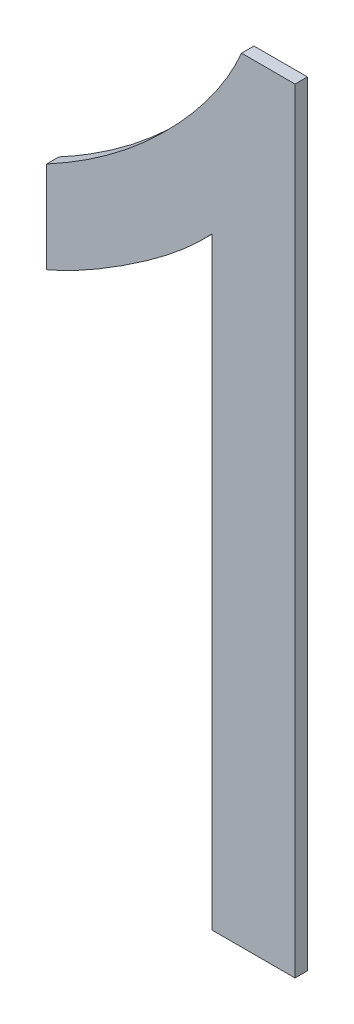
ISO-10303-21;
HEADER;
FILE_DESCRIPTION(('STEP AP214'),'2;1');
FILE_NAME('part.step','',(''),(''),'','','');
FILE_SCHEMA(('AUTOMOTIVE_DESIGN { 1 0 10303 214 1 1 1 1 }'));
ENDSEC;
DATA;
#1=APPLICATION_CONTEXT('core data for automotive mechanical design processes');
#2=APPLICATION_PROTOCOL_DEFINITION('international standard','automotive_design',2000,#1);
#3=PRODUCT_CONTEXT('',#1,'mechanical');
#4=PRODUCT('Part','Part','',(#3));
#5=PRODUCT_RELATED_PRODUCT_CATEGORY('part','',(#4));
#6=PRODUCT_DEFINITION_FORMATION('','',#4);
#7=PRODUCT_DEFINITION_CONTEXT('part definition',#1,'design');
#8=PRODUCT_DEFINITION('design','',#6,#7);
#9=PRODUCT_DEFINITION_SHAPE('','',#8);
#10=(LENGTH_UNIT() NAMED_UNIT(*) SI_UNIT(.MILLI.,.METRE.));
#11=(NAMED_UNIT(*) PLANE_ANGLE_UNIT() SI_UNIT($,.RADIAN.));
#12=(NAMED_UNIT(*) SI_UNIT($,.STERADIAN.) SOLID_ANGLE_UNIT());
#13=UNCERTAINTY_MEASURE_WITH_UNIT(LENGTH_MEASURE(1.E-05),#10,'distance_accuracy_value','');
#14=(GEOMETRIC_REPRESENTATION_CONTEXT(3) GLOBAL_UNCERTAINTY_ASSIGNED_CONTEXT((#13)) GLOBAL_UNIT_ASSIGNED_CONTEXT((#10,
#11,#12)) REPRESENTATION_CONTEXT('',''));
#15=CARTESIAN_POINT('',(0.,0.,0.));
#16=DIRECTION('',(0.,0.,1.));
#17=DIRECTION('',(1.,0.,0.));
#18=AXIS2_PLACEMENT_3D('',#15,#16,#17);
#19=CARTESIAN_POINT('',(2.420829277279,2.045230861556,1.11));
#20=DIRECTION('',(0.,0.,1.));
#21=DIRECTION('',(1.,0.,0.));
#22=AXIS2_PLACEMENT_3D('',#19,#20,#21);
#23=PLANE('',#22);
#24=DIRECTION('',(0.,1.,0.));
#25=VECTOR('',#24,1.);
#26=CARTESIAN_POINT('',(2.350671895533,2.005858178158,1.11));
#27=LINE('',#26,#25);
#28=CARTESIAN_POINT('',(2.350671895533,2.005858178158,1.11));
#29=VERTEX_POINT('',#28);
#30=CARTESIAN_POINT('',(2.350671895533,2.079661555173,1.11));
#31=VERTEX_POINT('',#30);
#32=EDGE_CURVE('E79',#29,#31,#27,.T.);
#33=ORIENTED_EDGE('',*,*,#32,.F.);
#34=CARTESIAN_POINT('',(2.484250601938,2.097794281422,1.11));
#35=CARTESIAN_POINT('',(2.48198701650468,2.09534058091258,1.11));
#36=CARTESIAN_POINT('',(2.47967240476367,2.09293513346055,1.11));
#37=CARTESIAN_POINT('',(2.47495516755422,2.08821521229537,1.11));
#38=CARTESIAN_POINT('',(2.4725526015537,2.08590067923014,1.11));
#39=CARTESIAN_POINT('',(2.46030040619767,2.07448990393132,1.11));
#40=CARTESIAN_POINT('',(2.44986724530582,2.06601649511369,1.11));
#41=CARTESIAN_POINT('',(2.42826373206573,2.05004923297731,1.11));
#42=CARTESIAN_POINT('',(2.41709135576111,2.04255825190439,1.11));
#43=CARTESIAN_POINT('',(2.39685681225412,2.0298426248223,1.11));
#44=CARTESIAN_POINT('',(2.38787975919878,2.02448514238348,1.11));
#45=CARTESIAN_POINT('',(2.36957839473494,2.01453142934613,1.11));
#46=CARTESIAN_POINT('',(2.36025611751061,2.00993140802081,1.11));
#47=CARTESIAN_POINT('',(2.350671895533,2.005858178158,1.11));
#48=B_SPLINE_CURVE_WITH_KNOTS('',3,(#34,#35,#36,#37,#38,#39,#40,#41,#42,#43,#44,#45,#46,#47),
.UNSPECIFIED.,.F.,.F.,(4,2,2,2,2,2,4),(0.,0.0100128481750778,0.0200190471259914,
0.0602358016008365,0.100567631074576,0.131904063335618,0.163078563736882),.UNSPECIFIED.);
#49=CARTESIAN_POINT('',(2.484250601938,2.097794281422,1.11));
#50=VERTEX_POINT('',#49);
#51=EDGE_CURVE('E176',#50,#29,#48,.T.);
#52=ORIENTED_EDGE('',*,*,#51,.F.);
#53=DIRECTION('',(0.,1.,0.));
#54=VECTOR('',#53,1.);
#55=CARTESIAN_POINT('',(2.484250601938,1.611391852731,1.11));
#56=LINE('',#55,#54);
#57=CARTESIAN_POINT('',(2.484250601938,1.611391852731,1.11));
#58=VERTEX_POINT('',#57);
#59=EDGE_CURVE('E130',#58,#50,#56,.T.);
#60=ORIENTED_EDGE('',*,*,#59,.F.);
#61=DIRECTION('',(1.,0.,0.));
#62=VECTOR('',#61,1.);
#63=CARTESIAN_POINT('',(2.55103995514,1.611391852731,1.11));
#64=LINE('',#63,#62);
#65=CARTESIAN_POINT('',(2.55103995514,1.611391852731,1.11));
#66=VERTEX_POINT('',#65);
#67=EDGE_CURVE('E125',#66,#58,#64,.F.);
#68=ORIENTED_EDGE('',*,*,#67,.F.);
#69=DIRECTION('',(0.,1.,0.));
#70=VECTOR('',#69,1.);
#71=CARTESIAN_POINT('',(2.55103995514,2.235698436319,1.11));
#72=LINE('',#71,#70);
#73=CARTESIAN_POINT('',(2.55103995514,2.235698436319,1.11));
#74=VERTEX_POINT('',#73);
#75=EDGE_CURVE('E96',#74,#66,#72,.F.);
#76=ORIENTED_EDGE('',*,*,#75,.F.);
#77=DIRECTION('',(1.,0.,0.));
#78=VECTOR('',#77,1.);
#79=CARTESIAN_POINT('',(2.50790516453,2.235698436319,1.11));
#80=LINE('',#79,#78);
#81=CARTESIAN_POINT('',(2.50790516453,2.235698436319,1.11));
#82=VERTEX_POINT('',#81);
#83=EDGE_CURVE('E94',#82,#74,#80,.T.);
#84=ORIENTED_EDGE('',*,*,#83,.F.);
#85=CARTESIAN_POINT('',(2.350671895533,2.079661555173,1.11));
#86=CARTESIAN_POINT('',(2.35654530439645,2.0828170617889,1.11));
#87=CARTESIAN_POINT('',(2.36234983727154,2.08610498024626,1.11));
#88=CARTESIAN_POINT('',(2.37959335986652,2.09640578820771,1.11));
#89=CARTESIAN_POINT('',(2.39079361968248,2.10382290423349,1.11));
#90=CARTESIAN_POINT('',(2.41240642351572,2.11973707684655,1.11));
#91=CARTESIAN_POINT('',(2.42281887448461,2.12823426068438,1.11));
#92=CARTESIAN_POINT('',(2.43770020110795,2.14174411779067,1.11));
#93=CARTESIAN_POINT('',(2.44252878913659,2.1463647099135,1.11));
#94=CARTESIAN_POINT('',(2.45194473883119,2.15583532033303,1.11));
#95=CARTESIAN_POINT('',(2.4565322924703,2.16068515001891,1.11));
#96=CARTESIAN_POINT('',(2.47039633924423,2.17610618301786,1.11));
#97=CARTESIAN_POINT('',(2.47925174991864,2.18707696799885,1.11));
#98=CARTESIAN_POINT('',(2.49119920418664,2.20450546832535,1.11));
#99=CARTESIAN_POINT('',(2.49496833453174,2.21049642169433,1.11));
#100=CARTESIAN_POINT('',(2.50191835633671,2.22283116989214,1.11));
#101=CARTESIAN_POINT('',(2.50509748730921,2.22917594950371,1.11));
#102=CARTESIAN_POINT('',(2.50790516453,2.235698436319,1.11));
#103=B_SPLINE_CURVE_WITH_KNOTS('',3,(#85,#86,#87,#88,#89,#90,#91,#92,#93,#94,#95,#96,#97,#98,
#99,#100,#101,#102),.UNSPECIFIED.,.F.,.F.,(4,2,2,2,2,2,2,2,4),(0.,0.0200050536586325,
0.0602425272926652,0.10048474599497,0.120525521335046,0.140550085298754,0.182704889379794,
0.203909580517864,0.225176560859281),.UNSPECIFIED.);
#104=EDGE_CURVE('E24',#31,#82,#103,.T.);
#105=ORIENTED_EDGE('',*,*,#104,.F.);
#106=EDGE_LOOP('',(#33,#52,#60,#68,#76,#84,#105));
#107=FACE_BOUND('',#106,.T.);
#108=ADVANCED_FACE('F17',(#107),#23,.T.);
#109=CARTESIAN_POINT('',(2.55103995514,2.235698436319,1.11));
#110=DIRECTION('',(1.,0.,0.));
#111=DIRECTION('',(0.,0.,-1.));
#112=AXIS2_PLACEMENT_3D('',#109,#110,#111);
#113=PLANE('',#112);
#114=DIRECTION('',(0.,1.,0.));
#115=VECTOR('',#114,1.);
#116=CARTESIAN_POINT('',(2.55103995514,2.045230861556,1.1));
#117=LINE('',#116,#115);
#118=CARTESIAN_POINT('',(2.55103995514,1.611391852731,1.1));
#119=VERTEX_POINT('',#118);
#120=CARTESIAN_POINT('',(2.55103995514,2.235698436319,1.1));
#121=VERTEX_POINT('',#120);
#122=EDGE_CURVE('E112',#119,#121,#117,.T.);
#123=ORIENTED_EDGE('',*,*,#122,.T.);
#124=DIRECTION('',(0.,0.,1.));
#125=VECTOR('',#124,1.);
#126=CARTESIAN_POINT('',(2.55103995514,2.235698436319,1.11));
#127=LINE('',#126,#125);
#128=EDGE_CURVE('E92',#74,#121,#127,.F.);
#129=ORIENTED_EDGE('',*,*,#128,.F.);
#130=ORIENTED_EDGE('',*,*,#75,.T.);
#131=DIRECTION('',(0.,0.,-1.));
#132=VECTOR('',#131,1.);
#133=CARTESIAN_POINT('',(2.55103995514,1.611391852731,1.11));
#134=LINE('',#133,#132);
#135=EDGE_CURVE('E115',#119,#66,#134,.F.);
#136=ORIENTED_EDGE('',*,*,#135,.F.);
#137=EDGE_LOOP('',(#123,#129,#130,#136));
#138=FACE_BOUND('',#137,.T.);
#139=ADVANCED_FACE('F167',(#138),#113,.T.);
#140=CARTESIAN_POINT('',(2.50790516453,2.235698436319,1.11));
#141=DIRECTION('',(0.,1.,0.));
#142=DIRECTION('',(0.,0.,1.));
#143=AXIS2_PLACEMENT_3D('',#140,#141,#142);
#144=PLANE('',#143);
#145=DIRECTION('',(1.,0.,0.));
#146=VECTOR('',#145,1.);
#147=CARTESIAN_POINT('',(2.420829277279,2.235698436319,1.1));
#148=LINE('',#147,#146);
#149=CARTESIAN_POINT('',(2.50790516453,2.235698436319,1.1));
#150=VERTEX_POINT('',#149);
#151=EDGE_CURVE('E103',#121,#150,#148,.F.);
#152=ORIENTED_EDGE('',*,*,#151,.T.);
#153=DIRECTION('',(0.,0.,-1.));
#154=VECTOR('',#153,1.);
#155=CARTESIAN_POINT('',(2.50790516453,2.235698436319,1.105));
#156=LINE('',#155,#154);
#157=EDGE_CURVE('E88',#82,#150,#156,.T.);
#158=ORIENTED_EDGE('',*,*,#157,.F.);
#159=ORIENTED_EDGE('',*,*,#83,.T.);
#160=ORIENTED_EDGE('',*,*,#128,.T.);
#161=EDGE_LOOP('',(#152,#158,#159,#160));
#162=FACE_BOUND('',#161,.T.);
#163=ADVANCED_FACE('F101',(#162),#144,.T.);
#164=CARTESIAN_POINT('',(2.350671895533,2.079661555173,1.11));
#165=CARTESIAN_POINT('',(2.350671895533,2.079661555173,1.1));
#166=CARTESIAN_POINT('',(2.387962617737,2.099702989449,1.11));
#167=CARTESIAN_POINT('',(2.387962617737,2.099702989449,1.1));
#168=CARTESIAN_POINT('',(2.420661571909,2.124039016783,1.11));
#169=CARTESIAN_POINT('',(2.420661571909,2.124039016783,1.1));
#170=CARTESIAN_POINT('',(2.476609230776,2.180993923525,1.11));
#171=CARTESIAN_POINT('',(2.476609230776,2.180993923525,1.1));
#172=CARTESIAN_POINT('',(2.496356172206,2.208817464949,1.11));
#173=CARTESIAN_POINT('',(2.496356172206,2.208817464949,1.1));
#174=CARTESIAN_POINT('',(2.50790516453,2.235698436319,1.11));
#175=CARTESIAN_POINT('',(2.50790516453,2.235698436319,1.1));
#176=B_SPLINE_SURFACE_WITH_KNOTS('',3,1,((#164,#165),(#166,#167),(#168,#169),(#170,#171),(#172,
#173),(#174,#175)),.UNSPECIFIED.,.F.,.F.,.F.,(4,2,4),(2,2),(0.,0.499896550102,1.),(0.,1.),.UNSPECIFIED.);
#177=CARTESIAN_POINT('',(2.50790516453,2.235698436319,1.1));
#178=CARTESIAN_POINT('',(2.50525863093719,2.22955759100521,1.1));
#179=CARTESIAN_POINT('',(2.50228694975985,2.22357328205006,1.1));
#180=CARTESIAN_POINT('',(2.4924955346722,2.20595058455844,1.1));
#181=CARTESIAN_POINT('',(2.4848420473745,2.19476969874483,1.1));
#182=CARTESIAN_POINT('',(2.46819045533764,2.17344737638529,1.1));
#183=CARTESIAN_POINT('',(2.45918724982893,2.16331014023607,1.1));
#184=CARTESIAN_POINT('',(2.44504859121431,2.14884539242523,1.1));
#185=CARTESIAN_POINT('',(2.44026136661624,2.14417379884545,1.1));
#186=CARTESIAN_POINT('',(2.43045639822626,2.13510449024433,1.1));
#187=CARTESIAN_POINT('',(2.42543927722939,2.13070610344323,1.1));
#188=CARTESIAN_POINT('',(2.40958620707663,2.11750726481689,1.1));
#189=CARTESIAN_POINT('',(2.39838095124761,2.10914682026167,1.1));
#190=CARTESIAN_POINT('',(2.37511345794947,2.09353939195043,1.1));
#191=CARTESIAN_POINT('',(2.36304616279148,2.08629993153091,1.1));
#192=CARTESIAN_POINT('',(2.350671895533,2.079661555173,1.1));
#193=B_SPLINE_CURVE_WITH_KNOTS('',3,(#177,#178,#179,#180,#181,#182,#183,#184,#185,#186,#187,
#188,#189,#190,#191,#192),.UNSPECIFIED.,.F.,.F.,(4,2,2,2,2,2,2,4),(0.,0.0200276017516876,
0.0604790442422037,0.101087402843664,0.121146642614684,0.141154429093648,0.18301895991956,
0.225153300971886),.UNSPECIFIED.);
#194=CARTESIAN_POINT('',(2.350671895533,2.079661555173,1.1));
#195=VERTEX_POINT('',#194);
#196=EDGE_CURVE('E145',#150,#195,#193,.T.);
#197=DIRECTION('',(0.,0.,1.));
#198=VECTOR('',#197,1.);
#199=CARTESIAN_POINT('',(2.350671895533,2.079661555173,1.11));
#200=LINE('',#199,#198);
#201=EDGE_CURVE('E90',#31,#195,#200,.F.);
#202=ORIENTED_EDGE('',*,*,#196,.T.);
#203=ORIENTED_EDGE('',*,*,#201,.F.);
#204=ORIENTED_EDGE('',*,*,#104,.T.);
#205=ORIENTED_EDGE('',*,*,#157,.T.);
#206=EDGE_LOOP('',(#202,#203,#204,#205));
#207=FACE_BOUND('',#206,.T.);
#208=ADVANCED_FACE('F86',(#207),#176,.T.);
#209=CARTESIAN_POINT('',(2.350671895533,2.005858178158,1.11));
#210=DIRECTION('',(-1.,0.,0.));
#211=DIRECTION('',(0.,0.,1.));
#212=AXIS2_PLACEMENT_3D('',#209,#210,#211);
#213=PLANE('',#212);
#214=DIRECTION('',(0.,1.,0.));
#215=VECTOR('',#214,1.);
#216=CARTESIAN_POINT('',(2.350671895533,2.045230861556,1.1));
#217=LINE('',#216,#215);
#218=CARTESIAN_POINT('',(2.350671895533,2.005858178158,1.1));
#219=VERTEX_POINT('',#218);
#220=EDGE_CURVE('E144',#195,#219,#217,.F.);
#221=ORIENTED_EDGE('',*,*,#220,.T.);
#222=DIRECTION('',(0.,0.,-1.));
#223=VECTOR('',#222,1.);
#224=CARTESIAN_POINT('',(2.350671895533,2.005858178158,1.105));
#225=LINE('',#224,#223);
#226=EDGE_CURVE('E132',#29,#219,#225,.T.);
#227=ORIENTED_EDGE('',*,*,#226,.F.);
#228=ORIENTED_EDGE('',*,*,#32,.T.);
#229=ORIENTED_EDGE('',*,*,#201,.T.);
#230=EDGE_LOOP('',(#221,#227,#228,#229));
#231=FACE_BOUND('',#230,.T.);
#232=ADVANCED_FACE('F162',(#231),#213,.T.);
#233=CARTESIAN_POINT('',(2.484250601938,2.097794281422,1.11));
#234=CARTESIAN_POINT('',(2.484250601938,2.097794281422,1.1));
#235=CARTESIAN_POINT('',(2.46810984158,2.080297791182,1.11));
#236=CARTESIAN_POINT('',(2.46810984158,2.080297791182,1.1));
#237=CARTESIAN_POINT('',(2.447099024219,2.062801300941,1.11));
#238=CARTESIAN_POINT('',(2.447099024219,2.062801300941,1.1));
#239=CARTESIAN_POINT('',(2.394706963567,2.027759003676,1.11));
#240=CARTESIAN_POINT('',(2.394706963567,2.027759003676,1.1));
#241=CARTESIAN_POINT('',(2.371404423923,2.014606423278,1.11));
#242=CARTESIAN_POINT('',(2.371404423923,2.014606423278,1.1));
#243=CARTESIAN_POINT('',(2.350671895533,2.005858178158,1.11));
#244=CARTESIAN_POINT('',(2.350671895533,2.005858178158,1.1));
#245=B_SPLINE_SURFACE_WITH_KNOTS('',3,1,((#233,#234),(#235,#236),(#237,#238),(#239,#240),(#241,
#242),(#243,#244)),.UNSPECIFIED.,.F.,.F.,.F.,(4,2,4),(2,2),(0.,0.49929632491,1.),(0.,1.),.UNSPECIFIED.);
#246=CARTESIAN_POINT('',(2.350671895533,2.005858178158,1.1));
#247=CARTESIAN_POINT('',(2.35374545334965,2.00715536495649,1.1));
#248=CARTESIAN_POINT('',(2.35679240638466,2.00851347238898,1.1));
#249=CARTESIAN_POINT('',(2.36283905883462,2.01133392696376,1.1));
#250=CARTESIAN_POINT('',(2.36583874181925,2.01279630941542,1.1));
#251=CARTESIAN_POINT('',(2.38076514106665,2.02034096789166,1.1));
#252=CARTESIAN_POINT('',(2.39236436211796,2.02707042783829,1.1));
#253=CARTESIAN_POINT('',(2.40941076935322,2.03770944515556,1.1));
#254=CARTESIAN_POINT('',(2.41503704031361,2.04134865100027,1.1));
#255=CARTESIAN_POINT('',(2.42616705512722,2.04880934596244,1.1));
#256=CARTESIAN_POINT('',(2.43167082568481,2.05263079476969,1.1));
#257=CARTESIAN_POINT('',(2.44553872737156,2.06274148667721,1.1));
#258=CARTESIAN_POINT('',(2.45377472155008,2.06921211691921,1.1));
#259=CARTESIAN_POINT('',(2.46957184314791,2.08290368617275,1.1));
#260=CARTESIAN_POINT('',(2.47713388337539,2.09012358076089,1.1));
#261=CARTESIAN_POINT('',(2.484250601938,2.097794281422,1.1));
#262=B_SPLINE_CURVE_WITH_KNOTS('',3,(#246,#247,#248,#249,#250,#251,#252,#253,#254,#255,#256,
#257,#258,#259,#260,#261),.UNSPECIFIED.,.F.,.F.,(4,2,2,2,2,2,2,4),(0.,0.0100063413576362,
0.0200160872788,0.0601775562632767,0.0802794939786955,0.100377005797557,0.131753143480201,
0.163086117923732),.UNSPECIFIED.);
#263=CARTESIAN_POINT('',(2.484250601938,2.097794281422,1.1));
#264=VERTEX_POINT('',#263);
#265=EDGE_CURVE('E137',#219,#264,#262,.T.);
#266=DIRECTION('',(0.,0.,1.));
#267=VECTOR('',#266,1.);
#268=CARTESIAN_POINT('',(2.484250601938,2.097794281422,1.11));
#269=LINE('',#268,#267);
#270=EDGE_CURVE('E127',#50,#264,#269,.F.);
#271=ORIENTED_EDGE('',*,*,#265,.T.);
#272=ORIENTED_EDGE('',*,*,#270,.F.);
#273=ORIENTED_EDGE('',*,*,#51,.T.);
#274=ORIENTED_EDGE('',*,*,#226,.T.);
#275=EDGE_LOOP('',(#271,#272,#273,#274));
#276=FACE_BOUND('',#275,.T.);
#277=ADVANCED_FACE('F19',(#276),#245,.T.);
#278=CARTESIAN_POINT('',(2.484250601938,1.611391852731,1.11));
#279=DIRECTION('',(-1.,0.,0.));
#280=DIRECTION('',(0.,0.,1.));
#281=AXIS2_PLACEMENT_3D('',#278,#279,#280);
#282=PLANE('',#281);
#283=DIRECTION('',(0.,1.,0.));
#284=VECTOR('',#283,1.);
#285=CARTESIAN_POINT('',(2.484250601938,2.045230861556,1.1));
#286=LINE('',#285,#284);
#287=CARTESIAN_POINT('',(2.484250601938,1.611391852731,1.1));
#288=VERTEX_POINT('',#287);
#289=EDGE_CURVE('E34',#264,#288,#286,.F.);
#290=ORIENTED_EDGE('',*,*,#289,.T.);
#291=DIRECTION('',(0.,0.,-1.));
#292=VECTOR('',#291,1.);
#293=CARTESIAN_POINT('',(2.484250601938,1.611391852731,1.11));
#294=LINE('',#293,#292);
#295=EDGE_CURVE('E42',#58,#288,#294,.T.);
#296=ORIENTED_EDGE('',*,*,#295,.F.);
#297=ORIENTED_EDGE('',*,*,#59,.T.);
#298=ORIENTED_EDGE('',*,*,#270,.T.);
#299=EDGE_LOOP('',(#290,#296,#297,#298));
#300=FACE_BOUND('',#299,.T.);
#301=ADVANCED_FACE('F158',(#300),#282,.T.);
#302=CARTESIAN_POINT('',(2.55103995514,1.611391852731,1.11));
#303=DIRECTION('',(0.,-1.,0.));
#304=DIRECTION('',(0.,0.,-1.));
#305=AXIS2_PLACEMENT_3D('',#302,#303,#304);
#306=PLANE('',#305);
#307=DIRECTION('',(1.,0.,0.));
#308=VECTOR('',#307,1.);
#309=CARTESIAN_POINT('',(2.420829277279,1.611391852731,1.1));
#310=LINE('',#309,#308);
#311=EDGE_CURVE('E11',#288,#119,#310,.T.);
#312=ORIENTED_EDGE('',*,*,#311,.T.);
#313=ORIENTED_EDGE('',*,*,#135,.T.);
#314=ORIENTED_EDGE('',*,*,#67,.T.);
#315=ORIENTED_EDGE('',*,*,#295,.T.);
#316=EDGE_LOOP('',(#312,#313,#314,#315));
#317=FACE_BOUND('',#316,.T.);
#318=ADVANCED_FACE('F153',(#317),#306,.T.);
#319=CARTESIAN_POINT('',(2.420829277279,2.045230861556,1.1));
#320=DIRECTION('',(0.,0.,1.));
#321=DIRECTION('',(1.,0.,0.));
#322=AXIS2_PLACEMENT_3D('',#319,#320,#321);
#323=PLANE('',#322);
#324=ORIENTED_EDGE('',*,*,#289,.F.);
#325=ORIENTED_EDGE('',*,*,#265,.F.);
#326=ORIENTED_EDGE('',*,*,#220,.F.);
#327=ORIENTED_EDGE('',*,*,#196,.F.);
#328=ORIENTED_EDGE('',*,*,#151,.F.);
#329=ORIENTED_EDGE('',*,*,#122,.F.);
#330=ORIENTED_EDGE('',*,*,#311,.F.);
#331=EDGE_LOOP('',(#324,#325,#326,#327,#328,#329,#330));
#332=FACE_BOUND('',#331,.T.);
#333=ADVANCED_FACE('F149',(#332),#323,.F.);
#334=CLOSED_SHELL('',(#108,#139,#163,#208,#232,#277,#301,#318,#333));
#335=MANIFOLD_SOLID_BREP('B1',#334);
#336=ADVANCED_BREP_SHAPE_REPRESENTATION('',(#18,#335),#14);
#337=SHAPE_DEFINITION_REPRESENTATION(#9,#336);
ENDSEC;
END-ISO-10303-21;
